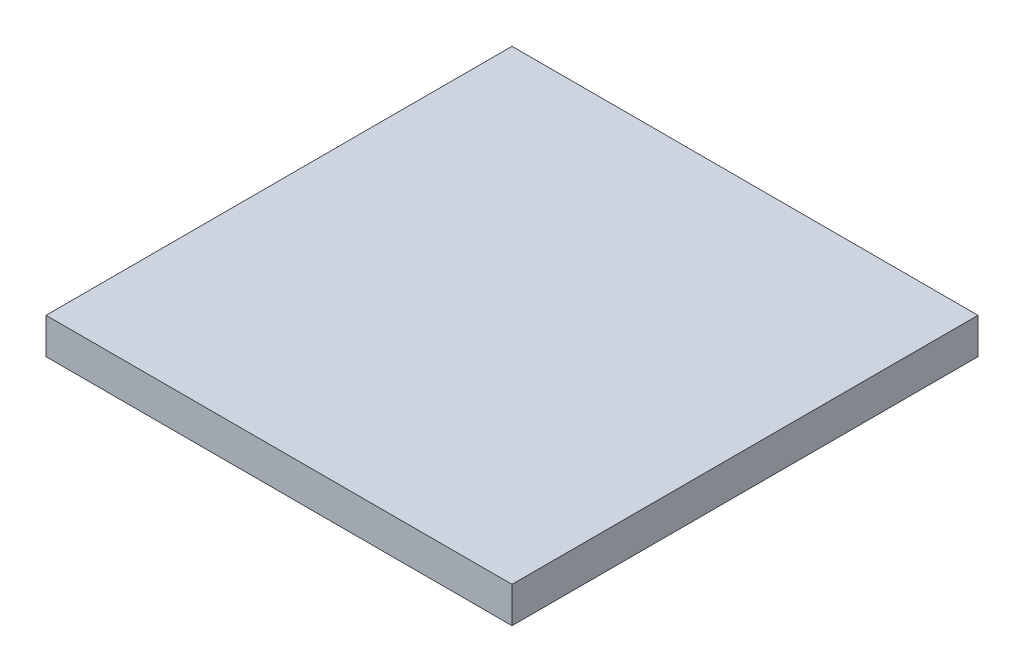
ISO-10303-21;
HEADER;
FILE_DESCRIPTION(('STEP AP214'),'2;1');
FILE_NAME('part.step','',(''),(''),'','','');
FILE_SCHEMA(('AUTOMOTIVE_DESIGN { 1 0 10303 214 1 1 1 1 }'));
ENDSEC;
DATA;
#1=APPLICATION_CONTEXT('core data for automotive mechanical design processes');
#2=APPLICATION_PROTOCOL_DEFINITION('international standard','automotive_design',2000,#1);
#3=PRODUCT_CONTEXT('',#1,'mechanical');
#4=PRODUCT('Part','Part','',(#3));
#5=PRODUCT_RELATED_PRODUCT_CATEGORY('part','',(#4));
#6=PRODUCT_DEFINITION_FORMATION('','',#4);
#7=PRODUCT_DEFINITION_CONTEXT('part definition',#1,'design');
#8=PRODUCT_DEFINITION('design','',#6,#7);
#9=PRODUCT_DEFINITION_SHAPE('','',#8);
#10=(LENGTH_UNIT() NAMED_UNIT(*) SI_UNIT(.MILLI.,.METRE.));
#11=(NAMED_UNIT(*) PLANE_ANGLE_UNIT() SI_UNIT($,.RADIAN.));
#12=(NAMED_UNIT(*) SI_UNIT($,.STERADIAN.) SOLID_ANGLE_UNIT());
#13=UNCERTAINTY_MEASURE_WITH_UNIT(LENGTH_MEASURE(1.E-05),#10,'distance_accuracy_value','');
#14=(GEOMETRIC_REPRESENTATION_CONTEXT(3) GLOBAL_UNCERTAINTY_ASSIGNED_CONTEXT((#13)) GLOBAL_UNIT_ASSIGNED_CONTEXT((#10,
#11,#12)) REPRESENTATION_CONTEXT('',''));
#15=CARTESIAN_POINT('',(0.,0.,0.));
#16=DIRECTION('',(0.,0.,1.));
#17=DIRECTION('',(1.,0.,0.));
#18=AXIS2_PLACEMENT_3D('',#15,#16,#17);
#19=CARTESIAN_POINT('',(0.,0.,0.));
#20=DIRECTION('',(0.,1.,0.));
#21=DIRECTION('',(0.,0.,1.));
#22=AXIS2_PLACEMENT_3D('',#19,#20,#21);
#23=PLANE('',#22);
#24=DIRECTION('',(-1.,0.,0.));
#25=VECTOR('',#24,1.);
#26=CARTESIAN_POINT('',(-6.5,0.,6.5));
#27=LINE('',#26,#25);
#28=CARTESIAN_POINT('',(6.5,0.,6.5));
#29=VERTEX_POINT('',#28);
#30=CARTESIAN_POINT('',(-6.5,0.,6.5));
#31=VERTEX_POINT('',#30);
#32=EDGE_CURVE('E82',#29,#31,#27,.T.);
#33=ORIENTED_EDGE('',*,*,#32,.T.);
#34=DIRECTION('',(0.,0.,-1.));
#35=VECTOR('',#34,1.);
#36=CARTESIAN_POINT('',(-6.5,0.,-6.5));
#37=LINE('',#36,#35);
#38=CARTESIAN_POINT('',(-6.5,0.,-6.5));
#39=VERTEX_POINT('',#38);
#40=EDGE_CURVE('E68',#31,#39,#37,.T.);
#41=ORIENTED_EDGE('',*,*,#40,.T.);
#42=DIRECTION('',(1.,0.,0.));
#43=VECTOR('',#42,1.);
#44=CARTESIAN_POINT('',(-6.5,0.,-6.5));
#45=LINE('',#44,#43);
#46=CARTESIAN_POINT('',(6.5,0.,-6.5));
#47=VERTEX_POINT('',#46);
#48=EDGE_CURVE('E55',#39,#47,#45,.T.);
#49=ORIENTED_EDGE('',*,*,#48,.T.);
#50=DIRECTION('',(0.,0.,1.));
#51=VECTOR('',#50,1.);
#52=CARTESIAN_POINT('',(6.5,0.,-6.5));
#53=LINE('',#52,#51);
#54=EDGE_CURVE('E20',#47,#29,#53,.T.);
#55=ORIENTED_EDGE('',*,*,#54,.T.);
#56=EDGE_LOOP('',(#33,#41,#49,#55));
#57=FACE_BOUND('',#56,.T.);
#58=ADVANCED_FACE('F17',(#57),#23,.F.);
#59=CARTESIAN_POINT('',(6.5,1.,-6.5));
#60=DIRECTION('',(-1.,0.,0.));
#61=DIRECTION('',(0.,0.,1.));
#62=AXIS2_PLACEMENT_3D('',#59,#60,#61);
#63=PLANE('',#62);
#64=DIRECTION('',(0.,1.,0.));
#65=VECTOR('',#64,1.);
#66=CARTESIAN_POINT('',(6.5,1.,-6.5));
#67=LINE('',#66,#65);
#68=CARTESIAN_POINT('',(6.5,1.,-6.5));
#69=VERTEX_POINT('',#68);
#70=EDGE_CURVE('E61',#47,#69,#67,.T.);
#71=ORIENTED_EDGE('',*,*,#70,.T.);
#72=DIRECTION('',(0.,0.,1.));
#73=VECTOR('',#72,1.);
#74=CARTESIAN_POINT('',(6.5,1.,0.));
#75=LINE('',#74,#73);
#76=CARTESIAN_POINT('',(6.5,1.,6.5));
#77=VERTEX_POINT('',#76);
#78=EDGE_CURVE('E84',#77,#69,#75,.F.);
#79=ORIENTED_EDGE('',*,*,#78,.F.);
#80=DIRECTION('',(0.,1.,0.));
#81=VECTOR('',#80,1.);
#82=CARTESIAN_POINT('',(6.5,1.,6.5));
#83=LINE('',#82,#81);
#84=EDGE_CURVE('E64',#77,#29,#83,.F.);
#85=ORIENTED_EDGE('',*,*,#84,.T.);
#86=ORIENTED_EDGE('',*,*,#54,.F.);
#87=EDGE_LOOP('',(#71,#79,#85,#86));
#88=FACE_BOUND('',#87,.T.);
#89=ADVANCED_FACE('F60',(#88),#63,.F.);
#90=CARTESIAN_POINT('',(-6.5,1.,-6.5));
#91=DIRECTION('',(0.,0.,1.));
#92=DIRECTION('',(1.,0.,0.));
#93=AXIS2_PLACEMENT_3D('',#90,#91,#92);
#94=PLANE('',#93);
#95=DIRECTION('',(0.,1.,0.));
#96=VECTOR('',#95,1.);
#97=CARTESIAN_POINT('',(-6.5,1.,-6.5));
#98=LINE('',#97,#96);
#99=CARTESIAN_POINT('',(-6.5,1.,-6.5));
#100=VERTEX_POINT('',#99);
#101=EDGE_CURVE('E71',#39,#100,#98,.T.);
#102=ORIENTED_EDGE('',*,*,#101,.T.);
#103=DIRECTION('',(1.,0.,0.));
#104=VECTOR('',#103,1.);
#105=CARTESIAN_POINT('',(0.,1.,-6.5));
#106=LINE('',#105,#104);
#107=EDGE_CURVE('E75',#69,#100,#106,.F.);
#108=ORIENTED_EDGE('',*,*,#107,.F.);
#109=ORIENTED_EDGE('',*,*,#70,.F.);
#110=ORIENTED_EDGE('',*,*,#48,.F.);
#111=EDGE_LOOP('',(#102,#108,#109,#110));
#112=FACE_BOUND('',#111,.T.);
#113=ADVANCED_FACE('F73',(#112),#94,.F.);
#114=CARTESIAN_POINT('',(-6.5,1.,-6.5));
#115=DIRECTION('',(1.,0.,0.));
#116=DIRECTION('',(0.,0.,-1.));
#117=AXIS2_PLACEMENT_3D('',#114,#115,#116);
#118=PLANE('',#117);
#119=DIRECTION('',(0.,1.,0.));
#120=VECTOR('',#119,1.);
#121=CARTESIAN_POINT('',(-6.5,1.,6.5));
#122=LINE('',#121,#120);
#123=CARTESIAN_POINT('',(-6.5,1.,6.5));
#124=VERTEX_POINT('',#123);
#125=EDGE_CURVE('E35',#31,#124,#122,.T.);
#126=ORIENTED_EDGE('',*,*,#125,.T.);
#127=DIRECTION('',(0.,0.,1.));
#128=VECTOR('',#127,1.);
#129=CARTESIAN_POINT('',(-6.5,1.,0.));
#130=LINE('',#129,#128);
#131=EDGE_CURVE('E26',#100,#124,#130,.T.);
#132=ORIENTED_EDGE('',*,*,#131,.F.);
#133=ORIENTED_EDGE('',*,*,#101,.F.);
#134=ORIENTED_EDGE('',*,*,#40,.F.);
#135=EDGE_LOOP('',(#126,#132,#133,#134));
#136=FACE_BOUND('',#135,.T.);
#137=ADVANCED_FACE('F91',(#136),#118,.F.);
#138=CARTESIAN_POINT('',(-6.5,1.,6.5));
#139=DIRECTION('',(0.,0.,-1.));
#140=DIRECTION('',(-1.,0.,0.));
#141=AXIS2_PLACEMENT_3D('',#138,#139,#140);
#142=PLANE('',#141);
#143=ORIENTED_EDGE('',*,*,#84,.F.);
#144=DIRECTION('',(1.,0.,0.));
#145=VECTOR('',#144,1.);
#146=CARTESIAN_POINT('',(0.,1.,6.5));
#147=LINE('',#146,#145);
#148=EDGE_CURVE('E11',#124,#77,#147,.T.);
#149=ORIENTED_EDGE('',*,*,#148,.F.);
#150=ORIENTED_EDGE('',*,*,#125,.F.);
#151=ORIENTED_EDGE('',*,*,#32,.F.);
#152=EDGE_LOOP('',(#143,#149,#150,#151));
#153=FACE_BOUND('',#152,.T.);
#154=ADVANCED_FACE('F93',(#153),#142,.F.);
#155=CARTESIAN_POINT('',(0.,1.,0.));
#156=DIRECTION('',(0.,1.,0.));
#157=DIRECTION('',(0.,0.,1.));
#158=AXIS2_PLACEMENT_3D('',#155,#156,#157);
#159=PLANE('',#158);
#160=ORIENTED_EDGE('',*,*,#131,.T.);
#161=ORIENTED_EDGE('',*,*,#148,.T.);
#162=ORIENTED_EDGE('',*,*,#78,.T.);
#163=ORIENTED_EDGE('',*,*,#107,.T.);
#164=EDGE_LOOP('',(#160,#161,#162,#163));
#165=FACE_BOUND('',#164,.T.);
#166=ADVANCED_FACE('F90',(#165),#159,.T.);
#167=CLOSED_SHELL('',(#58,#89,#113,#137,#154,#166));
#168=MANIFOLD_SOLID_BREP('B1',#167);
#169=ADVANCED_BREP_SHAPE_REPRESENTATION('',(#18,#168),#14);
#170=SHAPE_DEFINITION_REPRESENTATION(#9,#169);
ENDSEC;
END-ISO-10303-21;
